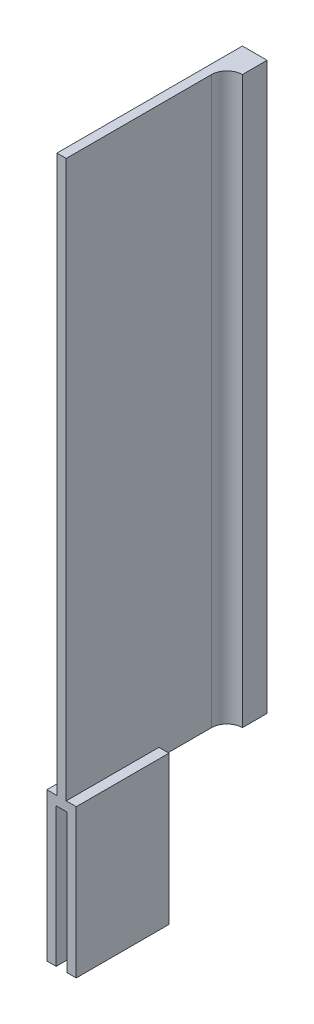
ISO-10303-21;
HEADER;
FILE_DESCRIPTION(('STEP AP214'),'2;1');
FILE_NAME('part.step','',(''),(''),'','','');
FILE_SCHEMA(('AUTOMOTIVE_DESIGN { 1 0 10303 214 1 1 1 1 }'));
ENDSEC;
DATA;
#1=APPLICATION_CONTEXT('core data for automotive mechanical design processes');
#2=APPLICATION_PROTOCOL_DEFINITION('international standard','automotive_design',2000,#1);
#3=PRODUCT_CONTEXT('',#1,'mechanical');
#4=PRODUCT('Part','Part','',(#3));
#5=PRODUCT_RELATED_PRODUCT_CATEGORY('part','',(#4));
#6=PRODUCT_DEFINITION_FORMATION('','',#4);
#7=PRODUCT_DEFINITION_CONTEXT('part definition',#1,'design');
#8=PRODUCT_DEFINITION('design','',#6,#7);
#9=PRODUCT_DEFINITION_SHAPE('','',#8);
#10=(LENGTH_UNIT() NAMED_UNIT(*) SI_UNIT(.MILLI.,.METRE.));
#11=(NAMED_UNIT(*) PLANE_ANGLE_UNIT() SI_UNIT($,.RADIAN.));
#12=(NAMED_UNIT(*) SI_UNIT($,.STERADIAN.) SOLID_ANGLE_UNIT());
#13=UNCERTAINTY_MEASURE_WITH_UNIT(LENGTH_MEASURE(1.E-05),#10,'distance_accuracy_value','');
#14=(GEOMETRIC_REPRESENTATION_CONTEXT(3) GLOBAL_UNCERTAINTY_ASSIGNED_CONTEXT((#13)) GLOBAL_UNIT_ASSIGNED_CONTEXT((#10,
#11,#12)) REPRESENTATION_CONTEXT('',''));
#15=CARTESIAN_POINT('',(0.,0.,0.));
#16=DIRECTION('',(0.,0.,1.));
#17=DIRECTION('',(1.,0.,0.));
#18=AXIS2_PLACEMENT_3D('',#15,#16,#17);
#19=CARTESIAN_POINT('',(32.5,0.,0.));
#20=DIRECTION('',(0.,0.,-1.));
#21=DIRECTION('',(1.,0.,0.));
#22=AXIS2_PLACEMENT_3D('',#19,#20,#21);
#23=PLANE('',#22);
#24=DIRECTION('',(1.,0.,0.));
#25=VECTOR('',#24,1.);
#26=CARTESIAN_POINT('',(32.5,45.,0.));
#27=LINE('',#26,#25);
#28=CARTESIAN_POINT('',(29.25,45.,0.));
#29=VERTEX_POINT('',#28);
#30=CARTESIAN_POINT('',(29.5,45.,0.));
#31=VERTEX_POINT('',#30);
#32=EDGE_CURVE('E202',#29,#31,#27,.T.);
#33=ORIENTED_EDGE('',*,*,#32,.F.);
#34=DIRECTION('',(0.,1.,0.));
#35=VECTOR('',#34,1.);
#36=CARTESIAN_POINT('',(29.25,13.95165060748,0.));
#37=LINE('',#36,#35);
#38=CARTESIAN_POINT('',(29.25,48.,0.));
#39=VERTEX_POINT('',#38);
#40=EDGE_CURVE('E171',#29,#39,#37,.T.);
#41=ORIENTED_EDGE('',*,*,#40,.T.);
#42=DIRECTION('',(1.,0.,0.));
#43=VECTOR('',#42,1.);
#44=CARTESIAN_POINT('',(32.5,48.,0.));
#45=LINE('',#44,#43);
#46=CARTESIAN_POINT('',(32.5,48.,0.));
#47=VERTEX_POINT('',#46);
#48=EDGE_CURVE('E188',#39,#47,#45,.T.);
#49=ORIENTED_EDGE('',*,*,#48,.T.);
#50=DIRECTION('',(0.,-1.,0.));
#51=VECTOR('',#50,1.);
#52=CARTESIAN_POINT('',(32.5,0.,0.));
#53=LINE('',#52,#51);
#54=CARTESIAN_POINT('',(32.5,0.,0.));
#55=VERTEX_POINT('',#54);
#56=EDGE_CURVE('E211',#47,#55,#53,.T.);
#57=ORIENTED_EDGE('',*,*,#56,.T.);
#58=DIRECTION('',(-1.,0.,0.));
#59=VECTOR('',#58,1.);
#60=CARTESIAN_POINT('',(32.5,0.,0.));
#61=LINE('',#60,#59);
#62=CARTESIAN_POINT('',(29.5,0.,0.));
#63=VERTEX_POINT('',#62);
#64=EDGE_CURVE('E228',#55,#63,#61,.T.);
#65=ORIENTED_EDGE('',*,*,#64,.T.);
#66=DIRECTION('',(0.,1.,0.));
#67=VECTOR('',#66,1.);
#68=CARTESIAN_POINT('',(29.5,0.,0.));
#69=LINE('',#68,#67);
#70=EDGE_CURVE('E217',#63,#31,#69,.T.);
#71=ORIENTED_EDGE('',*,*,#70,.T.);
#72=EDGE_LOOP('',(#33,#41,#49,#57,#65,#71));
#73=FACE_BOUND('',#72,.T.);
#74=ADVANCED_FACE('F45',(#73),#23,.T.);
#75=CARTESIAN_POINT('',(23.,48.,0.));
#76=VERTEX_POINT('',#75);
#77=CARTESIAN_POINT('',(26.25,48.,0.));
#78=VERTEX_POINT('',#77);
#79=EDGE_CURVE('E177',#76,#78,#45,.T.);
#80=ORIENTED_EDGE('',*,*,#79,.T.);
#81=DIRECTION('',(0.,1.,0.));
#82=VECTOR('',#81,1.);
#83=CARTESIAN_POINT('',(26.25,13.95165060748,0.));
#84=LINE('',#83,#82);
#85=CARTESIAN_POINT('',(26.25,45.,0.));
#86=VERTEX_POINT('',#85);
#87=EDGE_CURVE('E158',#86,#78,#84,.T.);
#88=ORIENTED_EDGE('',*,*,#87,.F.);
#89=CARTESIAN_POINT('',(26.,45.,0.));
#90=VERTEX_POINT('',#89);
#91=EDGE_CURVE('E204',#90,#86,#27,.T.);
#92=ORIENTED_EDGE('',*,*,#91,.F.);
#93=DIRECTION('',(0.,-1.,0.));
#94=VECTOR('',#93,1.);
#95=CARTESIAN_POINT('',(26.,0.,0.));
#96=LINE('',#95,#94);
#97=CARTESIAN_POINT('',(26.,0.,0.));
#98=VERTEX_POINT('',#97);
#99=EDGE_CURVE('E203',#90,#98,#96,.T.);
#100=ORIENTED_EDGE('',*,*,#99,.T.);
#101=DIRECTION('',(-1.,0.,0.));
#102=VECTOR('',#101,1.);
#103=CARTESIAN_POINT('',(26.,0.,0.));
#104=LINE('',#103,#102);
#105=CARTESIAN_POINT('',(23.,0.,0.));
#106=VERTEX_POINT('',#105);
#107=EDGE_CURVE('E314',#98,#106,#104,.T.);
#108=ORIENTED_EDGE('',*,*,#107,.T.);
#109=DIRECTION('',(0.,-1.,0.));
#110=VECTOR('',#109,1.);
#111=CARTESIAN_POINT('',(23.,48.,0.));
#112=LINE('',#111,#110);
#113=EDGE_CURVE('E185',#76,#106,#112,.T.);
#114=ORIENTED_EDGE('',*,*,#113,.F.);
#115=EDGE_LOOP('',(#80,#88,#92,#100,#108,#114));
#116=FACE_BOUND('',#115,.T.);
#117=ADVANCED_FACE('F182',(#116),#23,.T.);
#118=CARTESIAN_POINT('',(32.5,48.,0.));
#119=DIRECTION('',(0.,1.,0.));
#120=DIRECTION('',(0.,0.,1.));
#121=AXIS2_PLACEMENT_3D('',#118,#119,#120);
#122=PLANE('',#121);
#123=ORIENTED_EDGE('',*,*,#79,.F.);
#124=DIRECTION('',(0.,0.,-1.));
#125=VECTOR('',#124,1.);
#126=CARTESIAN_POINT('',(23.,48.,0.));
#127=LINE('',#126,#125);
#128=CARTESIAN_POINT('',(23.,48.,30.));
#129=VERTEX_POINT('',#128);
#130=EDGE_CURVE('E194',#129,#76,#127,.T.);
#131=ORIENTED_EDGE('',*,*,#130,.F.);
#132=DIRECTION('',(-1.,0.,0.));
#133=VECTOR('',#132,1.);
#134=CARTESIAN_POINT('',(32.5,48.,30.));
#135=LINE('',#134,#133);
#136=CARTESIAN_POINT('',(26.25,48.,30.));
#137=VERTEX_POINT('',#136);
#138=EDGE_CURVE('E178',#137,#129,#135,.T.);
#139=ORIENTED_EDGE('',*,*,#138,.F.);
#140=DIRECTION('',(0.,0.,1.));
#141=VECTOR('',#140,1.);
#142=CARTESIAN_POINT('',(26.25,48.,-30.));
#143=LINE('',#142,#141);
#144=EDGE_CURVE('E161',#78,#137,#143,.T.);
#145=ORIENTED_EDGE('',*,*,#144,.F.);
#146=EDGE_LOOP('',(#123,#131,#139,#145));
#147=FACE_BOUND('',#146,.T.);
#148=ADVANCED_FACE('F175',(#147),#122,.T.);
#149=CARTESIAN_POINT('',(32.5,45.,0.));
#150=DIRECTION('',(0.,1.,0.));
#151=DIRECTION('',(0.,0.,1.));
#152=AXIS2_PLACEMENT_3D('',#149,#150,#151);
#153=PLANE('',#152);
#154=DIRECTION('',(0.,0.,-1.));
#155=VECTOR('',#154,1.);
#156=CARTESIAN_POINT('',(26.,45.,30.));
#157=LINE('',#156,#155);
#158=CARTESIAN_POINT('',(26.,45.,30.));
#159=VERTEX_POINT('',#158);
#160=EDGE_CURVE('E310',#159,#90,#157,.T.);
#161=ORIENTED_EDGE('',*,*,#160,.T.);
#162=ORIENTED_EDGE('',*,*,#91,.T.);
#163=DIRECTION('',(0.,0.,1.));
#164=VECTOR('',#163,1.);
#165=CARTESIAN_POINT('',(26.25,45.,0.));
#166=LINE('',#165,#164);
#167=CARTESIAN_POINT('',(26.25,45.,-30.));
#168=VERTEX_POINT('',#167);
#169=EDGE_CURVE('E164',#168,#86,#166,.T.);
#170=ORIENTED_EDGE('',*,*,#169,.F.);
#171=DIRECTION('',(-1.,0.,0.));
#172=VECTOR('',#171,1.);
#173=CARTESIAN_POINT('',(26.25,45.,-30.));
#174=LINE('',#173,#172);
#175=CARTESIAN_POINT('',(34.25,45.,-30.));
#176=VERTEX_POINT('',#175);
#177=EDGE_CURVE('E349',#176,#168,#174,.T.);
#178=ORIENTED_EDGE('',*,*,#177,.F.);
#179=DIRECTION('',(0.,0.,-1.));
#180=VECTOR('',#179,1.);
#181=CARTESIAN_POINT('',(34.25,45.,-30.));
#182=LINE('',#181,#180);
#183=CARTESIAN_POINT('',(34.25,45.,-22.));
#184=VERTEX_POINT('',#183);
#185=EDGE_CURVE('E259',#184,#176,#182,.T.);
#186=ORIENTED_EDGE('',*,*,#185,.F.);
#187=CARTESIAN_POINT('',(34.25,45.,-17.));
#188=DIRECTION('',(0.,1.,0.));
#189=DIRECTION('',(0.,0.,1.));
#190=AXIS2_PLACEMENT_3D('',#187,#188,#189);
#191=CIRCLE('',#190,5.);
#192=CARTESIAN_POINT('',(29.25,45.,-17.));
#193=VERTEX_POINT('',#192);
#194=EDGE_CURVE('E248',#193,#184,#191,.F.);
#195=ORIENTED_EDGE('',*,*,#194,.F.);
#196=DIRECTION('',(0.,0.,-1.));
#197=VECTOR('',#196,1.);
#198=CARTESIAN_POINT('',(29.25,45.,-17.));
#199=LINE('',#198,#197);
#200=EDGE_CURVE('E170',#29,#193,#199,.T.);
#201=ORIENTED_EDGE('',*,*,#200,.F.);
#202=ORIENTED_EDGE('',*,*,#32,.T.);
#203=DIRECTION('',(0.,0.,-1.));
#204=VECTOR('',#203,1.);
#205=CARTESIAN_POINT('',(29.5,45.,30.));
#206=LINE('',#205,#204);
#207=CARTESIAN_POINT('',(29.5,45.,30.));
#208=VERTEX_POINT('',#207);
#209=EDGE_CURVE('E224',#208,#31,#206,.T.);
#210=ORIENTED_EDGE('',*,*,#209,.F.);
#211=DIRECTION('',(-1.,0.,0.));
#212=VECTOR('',#211,1.);
#213=CARTESIAN_POINT('',(32.5,45.,30.));
#214=LINE('',#213,#212);
#215=EDGE_CURVE('E198',#208,#159,#214,.T.);
#216=ORIENTED_EDGE('',*,*,#215,.T.);
#217=EDGE_LOOP('',(#161,#162,#170,#178,#186,#195,#201,#202,#210,#216));
#218=FACE_BOUND('',#217,.T.);
#219=ADVANCED_FACE('F255',(#218),#153,.F.);
#220=CARTESIAN_POINT('',(32.5,0.,30.));
#221=DIRECTION('',(-1.,0.,0.));
#222=DIRECTION('',(0.,0.,-1.));
#223=AXIS2_PLACEMENT_3D('',#220,#221,#222);
#224=PLANE('',#223);
#225=ORIENTED_EDGE('',*,*,#56,.F.);
#226=DIRECTION('',(0.,0.,1.));
#227=VECTOR('',#226,1.);
#228=CARTESIAN_POINT('',(32.5,48.,0.));
#229=LINE('',#228,#227);
#230=CARTESIAN_POINT('',(32.5,48.,30.));
#231=VERTEX_POINT('',#230);
#232=EDGE_CURVE('E206',#47,#231,#229,.T.);
#233=ORIENTED_EDGE('',*,*,#232,.T.);
#234=DIRECTION('',(0.,-1.,0.));
#235=VECTOR('',#234,1.);
#236=CARTESIAN_POINT('',(32.5,0.,30.));
#237=LINE('',#236,#235);
#238=CARTESIAN_POINT('',(32.5,0.,30.));
#239=VERTEX_POINT('',#238);
#240=EDGE_CURVE('E212',#231,#239,#237,.T.);
#241=ORIENTED_EDGE('',*,*,#240,.T.);
#242=DIRECTION('',(0.,0.,-1.));
#243=VECTOR('',#242,1.);
#244=CARTESIAN_POINT('',(32.5,0.,30.));
#245=LINE('',#244,#243);
#246=EDGE_CURVE('E242',#239,#55,#245,.T.);
#247=ORIENTED_EDGE('',*,*,#246,.T.);
#248=EDGE_LOOP('',(#225,#233,#241,#247));
#249=FACE_BOUND('',#248,.T.);
#250=ADVANCED_FACE('F368',(#249),#224,.F.);
#251=CARTESIAN_POINT('',(32.5,0.,30.));
#252=DIRECTION('',(0.,1.,0.));
#253=DIRECTION('',(0.,0.,1.));
#254=AXIS2_PLACEMENT_3D('',#251,#252,#253);
#255=PLANE('',#254);
#256=ORIENTED_EDGE('',*,*,#64,.F.);
#257=ORIENTED_EDGE('',*,*,#246,.F.);
#258=DIRECTION('',(-1.,0.,0.));
#259=VECTOR('',#258,1.);
#260=CARTESIAN_POINT('',(32.5,0.,30.));
#261=LINE('',#260,#259);
#262=CARTESIAN_POINT('',(29.5,0.,30.));
#263=VERTEX_POINT('',#262);
#264=EDGE_CURVE('E216',#239,#263,#261,.T.);
#265=ORIENTED_EDGE('',*,*,#264,.T.);
#266=DIRECTION('',(0.,0.,-1.));
#267=VECTOR('',#266,1.);
#268=CARTESIAN_POINT('',(29.5,0.,30.));
#269=LINE('',#268,#267);
#270=EDGE_CURVE('E238',#263,#63,#269,.T.);
#271=ORIENTED_EDGE('',*,*,#270,.T.);
#272=EDGE_LOOP('',(#256,#257,#265,#271));
#273=FACE_BOUND('',#272,.T.);
#274=ADVANCED_FACE('F371',(#273),#255,.F.);
#275=CARTESIAN_POINT('',(29.5,0.,30.));
#276=DIRECTION('',(1.,0.,0.));
#277=DIRECTION('',(0.,0.,1.));
#278=AXIS2_PLACEMENT_3D('',#275,#276,#277);
#279=PLANE('',#278);
#280=ORIENTED_EDGE('',*,*,#70,.F.);
#281=ORIENTED_EDGE('',*,*,#270,.F.);
#282=DIRECTION('',(0.,1.,0.));
#283=VECTOR('',#282,1.);
#284=CARTESIAN_POINT('',(29.5,0.,30.));
#285=LINE('',#284,#283);
#286=EDGE_CURVE('E221',#263,#208,#285,.T.);
#287=ORIENTED_EDGE('',*,*,#286,.T.);
#288=ORIENTED_EDGE('',*,*,#209,.T.);
#289=EDGE_LOOP('',(#280,#281,#287,#288));
#290=FACE_BOUND('',#289,.T.);
#291=ADVANCED_FACE('F374',(#290),#279,.F.);
#292=CARTESIAN_POINT('',(32.5,0.,30.));
#293=DIRECTION('',(0.,0.,-1.));
#294=DIRECTION('',(1.,0.,0.));
#295=AXIS2_PLACEMENT_3D('',#292,#293,#294);
#296=PLANE('',#295);
#297=ORIENTED_EDGE('',*,*,#240,.F.);
#298=CARTESIAN_POINT('',(29.25,48.,30.));
#299=VERTEX_POINT('',#298);
#300=EDGE_CURVE('E329',#231,#299,#135,.T.);
#301=ORIENTED_EDGE('',*,*,#300,.T.);
#302=DIRECTION('',(0.,-1.,0.));
#303=VECTOR('',#302,1.);
#304=CARTESIAN_POINT('',(29.25,228.,30.));
#305=LINE('',#304,#303);
#306=CARTESIAN_POINT('',(29.25,228.,30.));
#307=VERTEX_POINT('',#306);
#308=EDGE_CURVE('E296',#307,#299,#305,.T.);
#309=ORIENTED_EDGE('',*,*,#308,.F.);
#310=DIRECTION('',(-1.,0.,0.));
#311=VECTOR('',#310,1.);
#312=CARTESIAN_POINT('',(29.25,228.,30.));
#313=LINE('',#312,#311);
#314=CARTESIAN_POINT('',(26.25,228.,30.));
#315=VERTEX_POINT('',#314);
#316=EDGE_CURVE('E287',#307,#315,#313,.T.);
#317=ORIENTED_EDGE('',*,*,#316,.T.);
#318=DIRECTION('',(0.,-1.,0.));
#319=VECTOR('',#318,1.);
#320=CARTESIAN_POINT('',(26.25,228.,30.));
#321=LINE('',#320,#319);
#322=EDGE_CURVE('E67',#315,#137,#321,.T.);
#323=ORIENTED_EDGE('',*,*,#322,.T.);
#324=ORIENTED_EDGE('',*,*,#138,.T.);
#325=DIRECTION('',(0.,-1.,0.));
#326=VECTOR('',#325,1.);
#327=CARTESIAN_POINT('',(23.,48.,30.));
#328=LINE('',#327,#326);
#329=CARTESIAN_POINT('',(23.,0.,30.));
#330=VERTEX_POINT('',#329);
#331=EDGE_CURVE('E192',#129,#330,#328,.T.);
#332=ORIENTED_EDGE('',*,*,#331,.T.);
#333=DIRECTION('',(-1.,0.,0.));
#334=VECTOR('',#333,1.);
#335=CARTESIAN_POINT('',(26.,0.,30.));
#336=LINE('',#335,#334);
#337=CARTESIAN_POINT('',(26.,0.,30.));
#338=VERTEX_POINT('',#337);
#339=EDGE_CURVE('E313',#338,#330,#336,.T.);
#340=ORIENTED_EDGE('',*,*,#339,.F.);
#341=DIRECTION('',(0.,-1.,0.));
#342=VECTOR('',#341,1.);
#343=CARTESIAN_POINT('',(26.,0.,30.));
#344=LINE('',#343,#342);
#345=EDGE_CURVE('E317',#159,#338,#344,.T.);
#346=ORIENTED_EDGE('',*,*,#345,.F.);
#347=ORIENTED_EDGE('',*,*,#215,.F.);
#348=ORIENTED_EDGE('',*,*,#286,.F.);
#349=ORIENTED_EDGE('',*,*,#264,.F.);
#350=EDGE_LOOP('',(#297,#301,#309,#317,#323,#324,#332,#340,#346,#347,#348,#349));
#351=FACE_BOUND('',#350,.T.);
#352=ADVANCED_FACE('F336',(#351),#296,.F.);
#353=CARTESIAN_POINT('',(23.,48.,0.));
#354=DIRECTION('',(1.,0.,0.));
#355=DIRECTION('',(0.,0.,1.));
#356=AXIS2_PLACEMENT_3D('',#353,#354,#355);
#357=PLANE('',#356);
#358=ORIENTED_EDGE('',*,*,#331,.F.);
#359=ORIENTED_EDGE('',*,*,#130,.T.);
#360=ORIENTED_EDGE('',*,*,#113,.T.);
#361=DIRECTION('',(0.,0.,-1.));
#362=VECTOR('',#361,1.);
#363=CARTESIAN_POINT('',(23.,0.,30.));
#364=LINE('',#363,#362);
#365=EDGE_CURVE('E307',#330,#106,#364,.T.);
#366=ORIENTED_EDGE('',*,*,#365,.F.);
#367=EDGE_LOOP('',(#358,#359,#360,#366));
#368=FACE_BOUND('',#367,.T.);
#369=ADVANCED_FACE('F339',(#368),#357,.F.);
#370=DIRECTION('',(0.,0.,1.));
#371=VECTOR('',#370,1.);
#372=CARTESIAN_POINT('',(29.25,48.,-30.));
#373=LINE('',#372,#371);
#374=EDGE_CURVE('E180',#39,#299,#373,.T.);
#375=ORIENTED_EDGE('',*,*,#374,.T.);
#376=ORIENTED_EDGE('',*,*,#300,.F.);
#377=ORIENTED_EDGE('',*,*,#232,.F.);
#378=ORIENTED_EDGE('',*,*,#48,.F.);
#379=EDGE_LOOP('',(#375,#376,#377,#378));
#380=FACE_BOUND('',#379,.T.);
#381=ADVANCED_FACE('F365',(#380),#122,.T.);
#382=CARTESIAN_POINT('',(26.,0.,30.));
#383=DIRECTION('',(-1.,0.,0.));
#384=DIRECTION('',(0.,0.,-1.));
#385=AXIS2_PLACEMENT_3D('',#382,#383,#384);
#386=PLANE('',#385);
#387=ORIENTED_EDGE('',*,*,#99,.F.);
#388=ORIENTED_EDGE('',*,*,#160,.F.);
#389=ORIENTED_EDGE('',*,*,#345,.T.);
#390=DIRECTION('',(0.,0.,-1.));
#391=VECTOR('',#390,1.);
#392=CARTESIAN_POINT('',(26.,0.,30.));
#393=LINE('',#392,#391);
#394=EDGE_CURVE('E300',#338,#98,#393,.T.);
#395=ORIENTED_EDGE('',*,*,#394,.T.);
#396=EDGE_LOOP('',(#387,#388,#389,#395));
#397=FACE_BOUND('',#396,.T.);
#398=ADVANCED_FACE('F347',(#397),#386,.F.);
#399=CARTESIAN_POINT('',(26.,0.,30.));
#400=DIRECTION('',(0.,1.,0.));
#401=DIRECTION('',(0.,0.,1.));
#402=AXIS2_PLACEMENT_3D('',#399,#400,#401);
#403=PLANE('',#402);
#404=ORIENTED_EDGE('',*,*,#107,.F.);
#405=ORIENTED_EDGE('',*,*,#394,.F.);
#406=ORIENTED_EDGE('',*,*,#339,.T.);
#407=ORIENTED_EDGE('',*,*,#365,.T.);
#408=EDGE_LOOP('',(#404,#405,#406,#407));
#409=FACE_BOUND('',#408,.T.);
#410=ADVANCED_FACE('F342',(#409),#403,.F.);
#411=CARTESIAN_POINT('',(29.25,228.,-30.));
#412=DIRECTION('',(0.,0.,-1.));
#413=DIRECTION('',(1.,0.,0.));
#414=AXIS2_PLACEMENT_3D('',#411,#412,#413);
#415=PLANE('',#414);
#416=DIRECTION('',(0.,1.,0.));
#417=VECTOR('',#416,1.);
#418=CARTESIAN_POINT('',(34.25,38.5660188679434,-30.));
#419=LINE('',#418,#417);
#420=CARTESIAN_POINT('',(34.25,228.,-30.));
#421=VERTEX_POINT('',#420);
#422=EDGE_CURVE('E274',#176,#421,#419,.T.);
#423=ORIENTED_EDGE('',*,*,#422,.F.);
#424=ORIENTED_EDGE('',*,*,#177,.T.);
#425=DIRECTION('',(0.,-1.,0.));
#426=VECTOR('',#425,1.);
#427=CARTESIAN_POINT('',(26.25,228.,-30.));
#428=LINE('',#427,#426);
#429=CARTESIAN_POINT('',(26.25,228.,-30.));
#430=VERTEX_POINT('',#429);
#431=EDGE_CURVE('E292',#430,#168,#428,.T.);
#432=ORIENTED_EDGE('',*,*,#431,.F.);
#433=DIRECTION('',(-1.,0.,0.));
#434=VECTOR('',#433,1.);
#435=CARTESIAN_POINT('',(29.25,228.,-30.));
#436=LINE('',#435,#434);
#437=EDGE_CURVE('E278',#421,#430,#436,.T.);
#438=ORIENTED_EDGE('',*,*,#437,.F.);
#439=EDGE_LOOP('',(#423,#424,#432,#438));
#440=FACE_BOUND('',#439,.T.);
#441=ADVANCED_FACE('F354',(#440),#415,.T.);
#442=CARTESIAN_POINT('',(29.25,228.,-30.));
#443=DIRECTION('',(-1.,0.,0.));
#444=DIRECTION('',(0.,0.,-1.));
#445=AXIS2_PLACEMENT_3D('',#442,#443,#444);
#446=PLANE('',#445);
#447=DIRECTION('',(0.,0.,1.));
#448=VECTOR('',#447,1.);
#449=CARTESIAN_POINT('',(29.25,228.,-30.));
#450=LINE('',#449,#448);
#451=CARTESIAN_POINT('',(29.25,228.,-17.));
#452=VERTEX_POINT('',#451);
#453=EDGE_CURVE('E290',#452,#307,#450,.T.);
#454=ORIENTED_EDGE('',*,*,#453,.T.);
#455=ORIENTED_EDGE('',*,*,#308,.T.);
#456=ORIENTED_EDGE('',*,*,#374,.F.);
#457=ORIENTED_EDGE('',*,*,#40,.F.);
#458=ORIENTED_EDGE('',*,*,#200,.T.);
#459=DIRECTION('',(0.,1.,0.));
#460=VECTOR('',#459,1.);
#461=CARTESIAN_POINT('',(29.25,228.,-17.));
#462=LINE('',#461,#460);
#463=EDGE_CURVE('E54',#452,#193,#462,.F.);
#464=ORIENTED_EDGE('',*,*,#463,.F.);
#465=EDGE_LOOP('',(#454,#455,#456,#457,#458,#464));
#466=FACE_BOUND('',#465,.T.);
#467=ADVANCED_FACE('F262',(#466),#446,.F.);
#468=CARTESIAN_POINT('',(26.25,228.,-30.));
#469=DIRECTION('',(-1.,0.,0.));
#470=DIRECTION('',(0.,0.,-1.));
#471=AXIS2_PLACEMENT_3D('',#468,#469,#470);
#472=PLANE('',#471);
#473=ORIENTED_EDGE('',*,*,#431,.T.);
#474=ORIENTED_EDGE('',*,*,#169,.T.);
#475=ORIENTED_EDGE('',*,*,#87,.T.);
#476=ORIENTED_EDGE('',*,*,#144,.T.);
#477=ORIENTED_EDGE('',*,*,#322,.F.);
#478=DIRECTION('',(0.,0.,1.));
#479=VECTOR('',#478,1.);
#480=CARTESIAN_POINT('',(26.25,228.,-30.));
#481=LINE('',#480,#479);
#482=EDGE_CURVE('E284',#430,#315,#481,.T.);
#483=ORIENTED_EDGE('',*,*,#482,.F.);
#484=EDGE_LOOP('',(#473,#474,#475,#476,#477,#483));
#485=FACE_BOUND('',#484,.T.);
#486=ADVANCED_FACE('F160',(#485),#472,.T.);
#487=CARTESIAN_POINT('',(32.5,228.,0.));
#488=DIRECTION('',(0.,-1.,0.));
#489=DIRECTION('',(0.,0.,-1.));
#490=AXIS2_PLACEMENT_3D('',#487,#488,#489);
#491=PLANE('',#490);
#492=ORIENTED_EDGE('',*,*,#437,.T.);
#493=ORIENTED_EDGE('',*,*,#482,.T.);
#494=ORIENTED_EDGE('',*,*,#316,.F.);
#495=ORIENTED_EDGE('',*,*,#453,.F.);
#496=CARTESIAN_POINT('',(34.25,228.,-17.));
#497=DIRECTION('',(0.,1.,0.));
#498=DIRECTION('',(0.,0.,-1.));
#499=AXIS2_PLACEMENT_3D('',#496,#497,#498);
#500=CIRCLE('',#499,5.);
#501=CARTESIAN_POINT('',(34.25,228.,-22.));
#502=VERTEX_POINT('',#501);
#503=EDGE_CURVE('E11',#502,#452,#500,.T.);
#504=ORIENTED_EDGE('',*,*,#503,.F.);
#505=DIRECTION('',(0.,0.,1.));
#506=VECTOR('',#505,1.);
#507=CARTESIAN_POINT('',(34.25,228.,-22.));
#508=LINE('',#507,#506);
#509=EDGE_CURVE('E269',#421,#502,#508,.T.);
#510=ORIENTED_EDGE('',*,*,#509,.F.);
#511=EDGE_LOOP('',(#492,#493,#494,#495,#504,#510));
#512=FACE_BOUND('',#511,.T.);
#513=ADVANCED_FACE('F404',(#512),#491,.F.);
#514=CARTESIAN_POINT('',(34.25,38.5660188679434,-22.));
#515=DIRECTION('',(1.,0.,0.));
#516=DIRECTION('',(0.,0.,1.));
#517=AXIS2_PLACEMENT_3D('',#514,#515,#516);
#518=PLANE('',#517);
#519=DIRECTION('',(0.,1.,0.));
#520=VECTOR('',#519,1.);
#521=CARTESIAN_POINT('',(34.25,38.5660188679434,-22.));
#522=LINE('',#521,#520);
#523=EDGE_CURVE('E273',#184,#502,#522,.T.);
#524=ORIENTED_EDGE('',*,*,#523,.F.);
#525=ORIENTED_EDGE('',*,*,#185,.T.);
#526=ORIENTED_EDGE('',*,*,#422,.T.);
#527=ORIENTED_EDGE('',*,*,#509,.T.);
#528=EDGE_LOOP('',(#524,#525,#526,#527));
#529=FACE_BOUND('',#528,.T.);
#530=ADVANCED_FACE('F408',(#529),#518,.T.);
#531=CARTESIAN_POINT('',(34.25,38.5660188679434,-17.));
#532=DIRECTION('',(0.,1.,0.));
#533=DIRECTION('',(0.,0.,1.));
#534=AXIS2_PLACEMENT_3D('',#531,#532,#533);
#535=CYLINDRICAL_SURFACE('',#534,5.);
#536=ORIENTED_EDGE('',*,*,#463,.T.);
#537=ORIENTED_EDGE('',*,*,#194,.T.);
#538=ORIENTED_EDGE('',*,*,#523,.T.);
#539=ORIENTED_EDGE('',*,*,#503,.T.);
#540=EDGE_LOOP('',(#536,#537,#538,#539));
#541=FACE_BOUND('',#540,.T.);
#542=ADVANCED_FACE('F47',(#541),#535,.F.);
#543=CLOSED_SHELL('',(#74,#117,#148,#219,#250,#274,#291,#352,#369,#381,#398,#410,#441,#467,#486,
#513,#530,#542));
#544=MANIFOLD_SOLID_BREP('B2',#543);
#545=ADVANCED_BREP_SHAPE_REPRESENTATION('',(#18,#544),#14);
#546=SHAPE_DEFINITION_REPRESENTATION(#9,#545);
ENDSEC;
END-ISO-10303-21;
